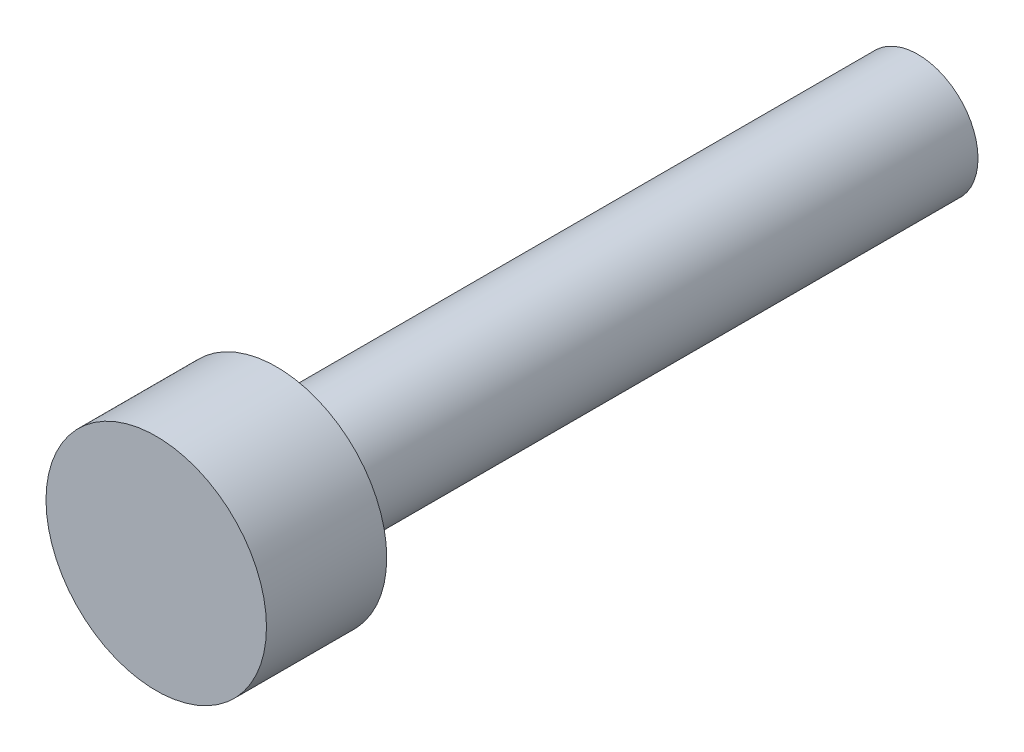
ISO-10303-21;
HEADER;
FILE_DESCRIPTION(('STEP AP214'),'2;1');
FILE_NAME('part.step','',(''),(''),'','','');
FILE_SCHEMA(('AUTOMOTIVE_DESIGN { 1 0 10303 214 1 1 1 1 }'));
ENDSEC;
DATA;
#1=APPLICATION_CONTEXT('core data for automotive mechanical design processes');
#2=APPLICATION_PROTOCOL_DEFINITION('international standard','automotive_design',2000,#1);
#3=PRODUCT_CONTEXT('',#1,'mechanical');
#4=PRODUCT('Part','Part','',(#3));
#5=PRODUCT_RELATED_PRODUCT_CATEGORY('part','',(#4));
#6=PRODUCT_DEFINITION_FORMATION('','',#4);
#7=PRODUCT_DEFINITION_CONTEXT('part definition',#1,'design');
#8=PRODUCT_DEFINITION('design','',#6,#7);
#9=PRODUCT_DEFINITION_SHAPE('','',#8);
#10=(LENGTH_UNIT() NAMED_UNIT(*) SI_UNIT(.MILLI.,.METRE.));
#11=(NAMED_UNIT(*) PLANE_ANGLE_UNIT() SI_UNIT($,.RADIAN.));
#12=(NAMED_UNIT(*) SI_UNIT($,.STERADIAN.) SOLID_ANGLE_UNIT());
#13=UNCERTAINTY_MEASURE_WITH_UNIT(LENGTH_MEASURE(1.E-05),#10,'distance_accuracy_value','');
#14=(GEOMETRIC_REPRESENTATION_CONTEXT(3) GLOBAL_UNCERTAINTY_ASSIGNED_CONTEXT((#13)) GLOBAL_UNIT_ASSIGNED_CONTEXT((#10,
#11,#12)) REPRESENTATION_CONTEXT('',''));
#15=CARTESIAN_POINT('',(0.,0.,0.));
#16=DIRECTION('',(0.,0.,1.));
#17=DIRECTION('',(1.,0.,0.));
#18=AXIS2_PLACEMENT_3D('',#15,#16,#17);
#19=CARTESIAN_POINT('',(0.,0.,0.));
#20=DIRECTION('',(0.,0.,-1.));
#21=DIRECTION('',(-1.,0.,0.));
#22=AXIS2_PLACEMENT_3D('',#19,#20,#21);
#23=CYLINDRICAL_SURFACE('',#22,1.5);
#24=CARTESIAN_POINT('',(0.,0.,0.));
#25=DIRECTION('',(0.,0.,1.));
#26=DIRECTION('',(1.,0.,0.));
#27=AXIS2_PLACEMENT_3D('',#24,#25,#26);
#28=CIRCLE('',#27,1.5);
#29=CARTESIAN_POINT('',(1.5,0.,0.));
#30=VERTEX_POINT('',#29);
#31=EDGE_CURVE('E10',#30,#30,#28,.T.);
#32=ORIENTED_EDGE('',*,*,#31,.F.);
#33=EDGE_LOOP('',(#32));
#34=FACE_BOUND('',#33,.T.);
#35=CARTESIAN_POINT('',(0.,0.,-16.));
#36=DIRECTION('',(0.,0.,1.));
#37=DIRECTION('',(1.,0.,0.));
#38=AXIS2_PLACEMENT_3D('',#35,#36,#37);
#39=CIRCLE('',#38,1.5);
#40=CARTESIAN_POINT('',(1.5,0.,-16.));
#41=VERTEX_POINT('',#40);
#42=EDGE_CURVE('E42',#41,#41,#39,.T.);
#43=ORIENTED_EDGE('',*,*,#42,.T.);
#44=EDGE_LOOP('',(#43));
#45=FACE_BOUND('',#44,.T.);
#46=ADVANCED_FACE('F41',(#34,#45),#23,.T.);
#47=CARTESIAN_POINT('',(0.,0.,-16.));
#48=DIRECTION('',(0.,0.,1.));
#49=DIRECTION('',(1.,0.,0.));
#50=AXIS2_PLACEMENT_3D('',#47,#48,#49);
#51=PLANE('',#50);
#52=ORIENTED_EDGE('',*,*,#42,.F.);
#53=EDGE_LOOP('',(#52));
#54=FACE_BOUND('',#53,.T.);
#55=ADVANCED_FACE('F62',(#54),#51,.F.);
#56=CARTESIAN_POINT('',(0.,0.,3.));
#57=DIRECTION('',(0.,0.,-1.));
#58=DIRECTION('',(-1.,0.,0.));
#59=AXIS2_PLACEMENT_3D('',#56,#57,#58);
#60=CYLINDRICAL_SURFACE('',#59,2.75);
#61=CARTESIAN_POINT('',(0.,0.,3.));
#62=DIRECTION('',(0.,0.,1.));
#63=DIRECTION('',(1.,0.,0.));
#64=AXIS2_PLACEMENT_3D('',#61,#62,#63);
#65=CIRCLE('',#64,2.75);
#66=CARTESIAN_POINT('',(2.75,0.,3.));
#67=VERTEX_POINT('',#66);
#68=EDGE_CURVE('E51',#67,#67,#65,.T.);
#69=ORIENTED_EDGE('',*,*,#68,.F.);
#70=EDGE_LOOP('',(#69));
#71=FACE_BOUND('',#70,.T.);
#72=CARTESIAN_POINT('',(0.,0.,0.));
#73=DIRECTION('',(0.,0.,1.));
#74=DIRECTION('',(1.,0.,0.));
#75=AXIS2_PLACEMENT_3D('',#72,#73,#74);
#76=CIRCLE('',#75,2.75);
#77=CARTESIAN_POINT('',(2.75,0.,0.));
#78=VERTEX_POINT('',#77);
#79=EDGE_CURVE('E52',#78,#78,#76,.T.);
#80=ORIENTED_EDGE('',*,*,#79,.T.);
#81=EDGE_LOOP('',(#80));
#82=FACE_BOUND('',#81,.T.);
#83=ADVANCED_FACE('F63',(#71,#82),#60,.T.);
#84=CARTESIAN_POINT('',(0.,0.,3.));
#85=DIRECTION('',(0.,0.,1.));
#86=DIRECTION('',(1.,0.,0.));
#87=AXIS2_PLACEMENT_3D('',#84,#85,#86);
#88=PLANE('',#87);
#89=ORIENTED_EDGE('',*,*,#68,.T.);
#90=EDGE_LOOP('',(#89));
#91=FACE_BOUND('',#90,.T.);
#92=ADVANCED_FACE('F56',(#91),#88,.T.);
#93=CARTESIAN_POINT('',(0.,0.,0.));
#94=DIRECTION('',(0.,0.,1.));
#95=DIRECTION('',(1.,0.,0.));
#96=AXIS2_PLACEMENT_3D('',#93,#94,#95);
#97=PLANE('',#96);
#98=ORIENTED_EDGE('',*,*,#31,.T.);
#99=EDGE_LOOP('',(#98));
#100=FACE_BOUND('',#99,.T.);
#101=ORIENTED_EDGE('',*,*,#79,.F.);
#102=EDGE_LOOP('',(#101));
#103=FACE_BOUND('',#102,.T.);
#104=ADVANCED_FACE('F66',(#100,#103),#97,.F.);
#105=CLOSED_SHELL('',(#46,#55,#83,#92,#104));
#106=MANIFOLD_SOLID_BREP('B2',#105);
#107=ADVANCED_BREP_SHAPE_REPRESENTATION('',(#18,#106),#14);
#108=SHAPE_DEFINITION_REPRESENTATION(#9,#107);
ENDSEC;
END-ISO-10303-21;
